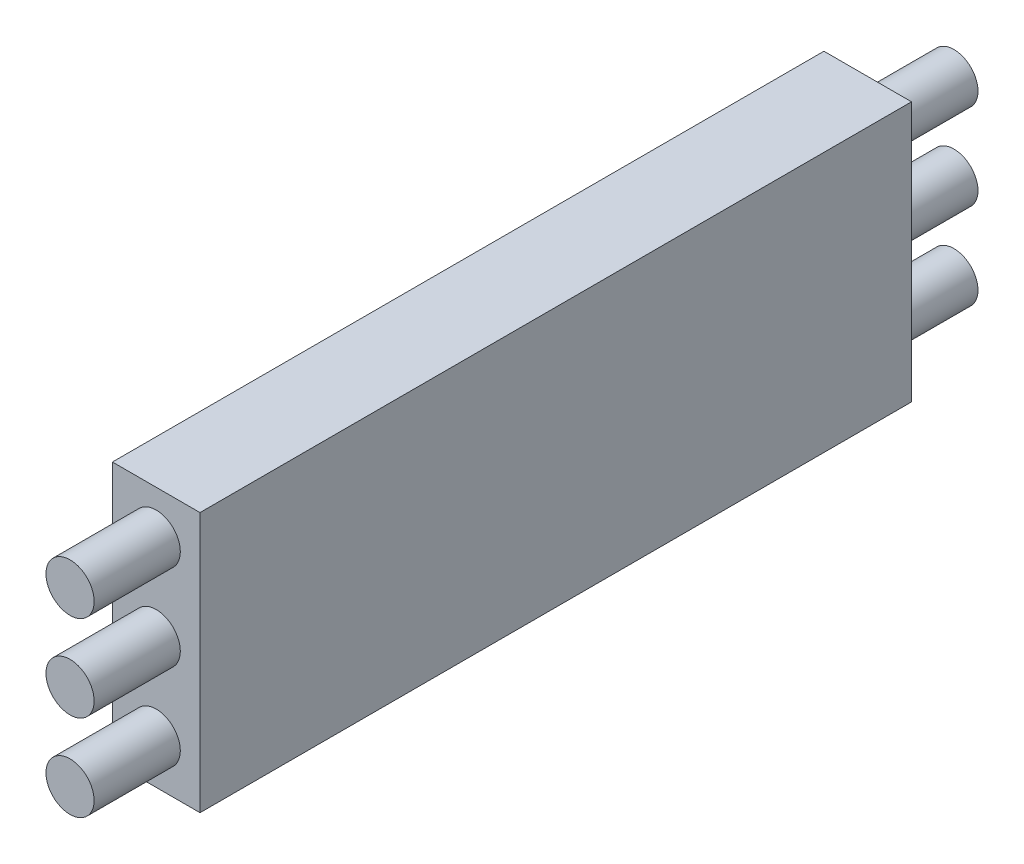
ISO-10303-21;
HEADER;
FILE_DESCRIPTION(('STEP AP214'),'2;1');
FILE_NAME('part.step','',(''),(''),'','','');
FILE_SCHEMA(('AUTOMOTIVE_DESIGN { 1 0 10303 214 1 1 1 1 }'));
ENDSEC;
DATA;
#1=APPLICATION_CONTEXT('core data for automotive mechanical design processes');
#2=APPLICATION_PROTOCOL_DEFINITION('international standard','automotive_design',2000,#1);
#3=PRODUCT_CONTEXT('',#1,'mechanical');
#4=PRODUCT('Part','Part','',(#3));
#5=PRODUCT_RELATED_PRODUCT_CATEGORY('part','',(#4));
#6=PRODUCT_DEFINITION_FORMATION('','',#4);
#7=PRODUCT_DEFINITION_CONTEXT('part definition',#1,'design');
#8=PRODUCT_DEFINITION('design','',#6,#7);
#9=PRODUCT_DEFINITION_SHAPE('','',#8);
#10=(LENGTH_UNIT() NAMED_UNIT(*) SI_UNIT(.MILLI.,.METRE.));
#11=(NAMED_UNIT(*) PLANE_ANGLE_UNIT() SI_UNIT($,.RADIAN.));
#12=(NAMED_UNIT(*) SI_UNIT($,.STERADIAN.) SOLID_ANGLE_UNIT());
#13=UNCERTAINTY_MEASURE_WITH_UNIT(LENGTH_MEASURE(1.E-05),#10,'distance_accuracy_value','');
#14=(GEOMETRIC_REPRESENTATION_CONTEXT(3) GLOBAL_UNCERTAINTY_ASSIGNED_CONTEXT((#13)) GLOBAL_UNIT_ASSIGNED_CONTEXT((#10,
#11,#12)) REPRESENTATION_CONTEXT('',''));
#15=CARTESIAN_POINT('',(0.,0.,0.));
#16=DIRECTION('',(0.,0.,1.));
#17=DIRECTION('',(1.,0.,0.));
#18=AXIS2_PLACEMENT_3D('',#15,#16,#17);
#19=CARTESIAN_POINT('',(110.,20.0000000000002,-10.));
#20=DIRECTION('',(0.,0.,1.));
#21=DIRECTION('',(1.,0.,0.));
#22=AXIS2_PLACEMENT_3D('',#19,#20,#21);
#23=CYLINDRICAL_SURFACE('',#22,2.79400000000001);
#24=CARTESIAN_POINT('',(110.,20.0000000000002,-10.));
#25=DIRECTION('',(0.,0.,1.));
#26=DIRECTION('',(1.,0.,0.));
#27=AXIS2_PLACEMENT_3D('',#24,#25,#26);
#28=CIRCLE('',#27,2.79400000000001);
#29=CARTESIAN_POINT('',(112.794,20.0000000000002,-10.));
#30=VERTEX_POINT('',#29);
#31=EDGE_CURVE('E11',#30,#30,#28,.T.);
#32=ORIENTED_EDGE('',*,*,#31,.T.);
#33=EDGE_LOOP('',(#32));
#34=FACE_BOUND('',#33,.T.);
#35=CARTESIAN_POINT('',(110.,20.0000000000002,0.));
#36=DIRECTION('',(0.,0.,1.));
#37=DIRECTION('',(1.,0.,0.));
#38=AXIS2_PLACEMENT_3D('',#35,#36,#37);
#39=CIRCLE('',#38,2.79400000000001);
#40=CARTESIAN_POINT('',(112.794,20.0000000000002,0.));
#41=VERTEX_POINT('',#40);
#42=EDGE_CURVE('E42',#41,#41,#39,.T.);
#43=ORIENTED_EDGE('',*,*,#42,.F.);
#44=EDGE_LOOP('',(#43));
#45=FACE_BOUND('',#44,.T.);
#46=ADVANCED_FACE('F39',(#34,#45),#23,.T.);
#47=CARTESIAN_POINT('',(110.,20.0000000000002,-10.));
#48=DIRECTION('',(0.,0.,1.));
#49=DIRECTION('',(1.,0.,0.));
#50=AXIS2_PLACEMENT_3D('',#47,#48,#49);
#51=PLANE('',#50);
#52=ORIENTED_EDGE('',*,*,#31,.F.);
#53=EDGE_LOOP('',(#52));
#54=FACE_BOUND('',#53,.T.);
#55=ADVANCED_FACE('F122',(#54),#51,.F.);
#56=CARTESIAN_POINT('',(104.92,4.92000000000019,82.55));
#57=DIRECTION('',(1.,0.,0.));
#58=DIRECTION('',(0.,0.,-1.));
#59=AXIS2_PLACEMENT_3D('',#56,#57,#58);
#60=PLANE('',#59);
#61=DIRECTION('',(0.,-1.,0.));
#62=VECTOR('',#61,1.);
#63=CARTESIAN_POINT('',(104.92,4.92000000000019,0.));
#64=LINE('',#63,#62);
#65=CARTESIAN_POINT('',(104.92,35.0800000000002,0.));
#66=VERTEX_POINT('',#65);
#67=CARTESIAN_POINT('',(104.92,4.92000000000019,0.));
#68=VERTEX_POINT('',#67);
#69=EDGE_CURVE('E106',#66,#68,#64,.T.);
#70=ORIENTED_EDGE('',*,*,#69,.T.);
#71=DIRECTION('',(0.,0.,-1.));
#72=VECTOR('',#71,1.);
#73=CARTESIAN_POINT('',(104.92,4.92000000000019,82.55));
#74=LINE('',#73,#72);
#75=CARTESIAN_POINT('',(104.92,4.92000000000019,82.55));
#76=VERTEX_POINT('',#75);
#77=EDGE_CURVE('E97',#76,#68,#74,.T.);
#78=ORIENTED_EDGE('',*,*,#77,.F.);
#79=DIRECTION('',(0.,-1.,0.));
#80=VECTOR('',#79,1.);
#81=CARTESIAN_POINT('',(104.92,4.92000000000019,82.55));
#82=LINE('',#81,#80);
#83=CARTESIAN_POINT('',(104.92,35.0800000000002,82.55));
#84=VERTEX_POINT('',#83);
#85=EDGE_CURVE('E91',#84,#76,#82,.T.);
#86=ORIENTED_EDGE('',*,*,#85,.F.);
#87=DIRECTION('',(0.,0.,-1.));
#88=VECTOR('',#87,1.);
#89=CARTESIAN_POINT('',(104.92,35.0800000000002,82.55));
#90=LINE('',#89,#88);
#91=EDGE_CURVE('E102',#84,#66,#90,.T.);
#92=ORIENTED_EDGE('',*,*,#91,.T.);
#93=EDGE_LOOP('',(#70,#78,#86,#92));
#94=FACE_BOUND('',#93,.T.);
#95=ADVANCED_FACE('F127',(#94),#60,.F.);
#96=CARTESIAN_POINT('',(115.08,4.92000000000019,82.55));
#97=DIRECTION('',(0.,1.,0.));
#98=DIRECTION('',(0.,0.,1.));
#99=AXIS2_PLACEMENT_3D('',#96,#97,#98);
#100=PLANE('',#99);
#101=DIRECTION('',(1.,0.,0.));
#102=VECTOR('',#101,1.);
#103=CARTESIAN_POINT('',(115.08,4.92000000000019,0.));
#104=LINE('',#103,#102);
#105=CARTESIAN_POINT('',(115.08,4.92000000000019,0.));
#106=VERTEX_POINT('',#105);
#107=EDGE_CURVE('E96',#68,#106,#104,.T.);
#108=ORIENTED_EDGE('',*,*,#107,.T.);
#109=DIRECTION('',(0.,0.,-1.));
#110=VECTOR('',#109,1.);
#111=CARTESIAN_POINT('',(115.08,4.92000000000019,82.55));
#112=LINE('',#111,#110);
#113=CARTESIAN_POINT('',(115.08,4.92000000000019,82.55));
#114=VERTEX_POINT('',#113);
#115=EDGE_CURVE('E94',#114,#106,#112,.T.);
#116=ORIENTED_EDGE('',*,*,#115,.F.);
#117=DIRECTION('',(1.,0.,0.));
#118=VECTOR('',#117,1.);
#119=CARTESIAN_POINT('',(115.08,4.92000000000019,82.55));
#120=LINE('',#119,#118);
#121=EDGE_CURVE('E86',#76,#114,#120,.T.);
#122=ORIENTED_EDGE('',*,*,#121,.F.);
#123=ORIENTED_EDGE('',*,*,#77,.T.);
#124=EDGE_LOOP('',(#108,#116,#122,#123));
#125=FACE_BOUND('',#124,.T.);
#126=ADVANCED_FACE('F95',(#125),#100,.F.);
#127=CARTESIAN_POINT('',(115.08,4.92000000000019,82.55));
#128=DIRECTION('',(-1.,0.,0.));
#129=DIRECTION('',(0.,0.,1.));
#130=AXIS2_PLACEMENT_3D('',#127,#128,#129);
#131=PLANE('',#130);
#132=DIRECTION('',(0.,1.,0.));
#133=VECTOR('',#132,1.);
#134=CARTESIAN_POINT('',(115.08,4.92000000000019,0.));
#135=LINE('',#134,#133);
#136=CARTESIAN_POINT('',(115.08,35.0800000000002,0.));
#137=VERTEX_POINT('',#136);
#138=EDGE_CURVE('E72',#106,#137,#135,.T.);
#139=ORIENTED_EDGE('',*,*,#138,.T.);
#140=DIRECTION('',(0.,0.,-1.));
#141=VECTOR('',#140,1.);
#142=CARTESIAN_POINT('',(115.08,35.0800000000002,82.55));
#143=LINE('',#142,#141);
#144=CARTESIAN_POINT('',(115.08,35.0800000000002,82.55));
#145=VERTEX_POINT('',#144);
#146=EDGE_CURVE('E98',#145,#137,#143,.T.);
#147=ORIENTED_EDGE('',*,*,#146,.F.);
#148=DIRECTION('',(0.,1.,0.));
#149=VECTOR('',#148,1.);
#150=CARTESIAN_POINT('',(115.08,4.92000000000019,82.55));
#151=LINE('',#150,#149);
#152=EDGE_CURVE('E89',#114,#145,#151,.T.);
#153=ORIENTED_EDGE('',*,*,#152,.F.);
#154=ORIENTED_EDGE('',*,*,#115,.T.);
#155=EDGE_LOOP('',(#139,#147,#153,#154));
#156=FACE_BOUND('',#155,.T.);
#157=ADVANCED_FACE('F100',(#156),#131,.F.);
#158=CARTESIAN_POINT('',(115.08,35.0800000000002,82.55));
#159=DIRECTION('',(0.,-1.,0.));
#160=DIRECTION('',(0.,0.,-1.));
#161=AXIS2_PLACEMENT_3D('',#158,#159,#160);
#162=PLANE('',#161);
#163=DIRECTION('',(-1.,0.,0.));
#164=VECTOR('',#163,1.);
#165=CARTESIAN_POINT('',(115.08,35.0800000000002,0.));
#166=LINE('',#165,#164);
#167=EDGE_CURVE('E78',#137,#66,#166,.T.);
#168=ORIENTED_EDGE('',*,*,#167,.T.);
#169=ORIENTED_EDGE('',*,*,#91,.F.);
#170=DIRECTION('',(-1.,0.,0.));
#171=VECTOR('',#170,1.);
#172=CARTESIAN_POINT('',(115.08,35.0800000000002,82.55));
#173=LINE('',#172,#171);
#174=EDGE_CURVE('E55',#145,#84,#173,.T.);
#175=ORIENTED_EDGE('',*,*,#174,.F.);
#176=ORIENTED_EDGE('',*,*,#146,.T.);
#177=EDGE_LOOP('',(#168,#169,#175,#176));
#178=FACE_BOUND('',#177,.T.);
#179=ADVANCED_FACE('F140',(#178),#162,.F.);
#180=CARTESIAN_POINT('',(0.,0.,82.55));
#181=DIRECTION('',(0.,0.,1.));
#182=DIRECTION('',(1.,0.,0.));
#183=AXIS2_PLACEMENT_3D('',#180,#181,#182);
#184=PLANE('',#183);
#185=CARTESIAN_POINT('',(110.,30.0000000000002,82.55));
#186=DIRECTION('',(0.,0.,1.));
#187=DIRECTION('',(1.,0.,0.));
#188=AXIS2_PLACEMENT_3D('',#185,#186,#187);
#189=CIRCLE('',#188,2.79400000000001);
#190=CARTESIAN_POINT('',(112.794,30.0000000000002,82.55));
#191=VERTEX_POINT('',#190);
#192=EDGE_CURVE('E196',#191,#191,#189,.T.);
#193=ORIENTED_EDGE('',*,*,#192,.F.);
#194=EDGE_LOOP('',(#193));
#195=FACE_BOUND('',#194,.T.);
#196=CARTESIAN_POINT('',(110.,20.0000000000002,82.55));
#197=DIRECTION('',(0.,0.,1.));
#198=DIRECTION('',(1.,0.,0.));
#199=AXIS2_PLACEMENT_3D('',#196,#197,#198);
#200=CIRCLE('',#199,2.79400000000001);
#201=CARTESIAN_POINT('',(112.794,20.0000000000002,82.55));
#202=VERTEX_POINT('',#201);
#203=EDGE_CURVE('E200',#202,#202,#200,.T.);
#204=ORIENTED_EDGE('',*,*,#203,.F.);
#205=EDGE_LOOP('',(#204));
#206=FACE_BOUND('',#205,.T.);
#207=CARTESIAN_POINT('',(110.,10.0000000000002,82.55));
#208=DIRECTION('',(0.,0.,1.));
#209=DIRECTION('',(1.,0.,0.));
#210=AXIS2_PLACEMENT_3D('',#207,#208,#209);
#211=CIRCLE('',#210,2.79400000000001);
#212=CARTESIAN_POINT('',(112.794,10.0000000000002,82.55));
#213=VERTEX_POINT('',#212);
#214=EDGE_CURVE('E205',#213,#213,#211,.T.);
#215=ORIENTED_EDGE('',*,*,#214,.F.);
#216=EDGE_LOOP('',(#215));
#217=FACE_BOUND('',#216,.T.);
#218=ORIENTED_EDGE('',*,*,#85,.T.);
#219=ORIENTED_EDGE('',*,*,#121,.T.);
#220=ORIENTED_EDGE('',*,*,#152,.T.);
#221=ORIENTED_EDGE('',*,*,#174,.T.);
#222=EDGE_LOOP('',(#218,#219,#220,#221));
#223=FACE_BOUND('',#222,.T.);
#224=ADVANCED_FACE('F87',(#195,#206,#217,#223),#184,.T.);
#225=CARTESIAN_POINT('',(0.,0.,0.));
#226=DIRECTION('',(0.,0.,1.));
#227=DIRECTION('',(1.,0.,0.));
#228=AXIS2_PLACEMENT_3D('',#225,#226,#227);
#229=PLANE('',#228);
#230=CARTESIAN_POINT('',(110.,30.0000000000002,0.));
#231=DIRECTION('',(0.,0.,1.));
#232=DIRECTION('',(1.,0.,0.));
#233=AXIS2_PLACEMENT_3D('',#230,#231,#232);
#234=CIRCLE('',#233,2.79400000000001);
#235=CARTESIAN_POINT('',(112.794,30.0000000000002,0.));
#236=VERTEX_POINT('',#235);
#237=EDGE_CURVE('E213',#236,#236,#234,.T.);
#238=ORIENTED_EDGE('',*,*,#237,.T.);
#239=EDGE_LOOP('',(#238));
#240=FACE_BOUND('',#239,.T.);
#241=CARTESIAN_POINT('',(110.,10.0000000000002,0.));
#242=DIRECTION('',(0.,0.,1.));
#243=DIRECTION('',(1.,0.,0.));
#244=AXIS2_PLACEMENT_3D('',#241,#242,#243);
#245=CIRCLE('',#244,2.79400000000001);
#246=CARTESIAN_POINT('',(112.794,10.0000000000002,0.));
#247=VERTEX_POINT('',#246);
#248=EDGE_CURVE('E109',#247,#247,#245,.T.);
#249=ORIENTED_EDGE('',*,*,#248,.T.);
#250=EDGE_LOOP('',(#249));
#251=FACE_BOUND('',#250,.T.);
#252=ORIENTED_EDGE('',*,*,#42,.T.);
#253=EDGE_LOOP('',(#252));
#254=FACE_BOUND('',#253,.T.);
#255=ORIENTED_EDGE('',*,*,#69,.F.);
#256=ORIENTED_EDGE('',*,*,#167,.F.);
#257=ORIENTED_EDGE('',*,*,#138,.F.);
#258=ORIENTED_EDGE('',*,*,#107,.F.);
#259=EDGE_LOOP('',(#255,#256,#257,#258));
#260=FACE_BOUND('',#259,.T.);
#261=ADVANCED_FACE('F118',(#240,#251,#254,#260),#229,.F.);
#262=CARTESIAN_POINT('',(110.,10.0000000000002,-10.));
#263=DIRECTION('',(0.,0.,1.));
#264=DIRECTION('',(1.,0.,0.));
#265=AXIS2_PLACEMENT_3D('',#262,#263,#264);
#266=CYLINDRICAL_SURFACE('',#265,2.79400000000001);
#267=CARTESIAN_POINT('',(110.,10.0000000000002,-10.));
#268=DIRECTION('',(0.,0.,1.));
#269=DIRECTION('',(1.,0.,0.));
#270=AXIS2_PLACEMENT_3D('',#267,#268,#269);
#271=CIRCLE('',#270,2.79400000000001);
#272=CARTESIAN_POINT('',(112.794,10.0000000000002,-10.));
#273=VERTEX_POINT('',#272);
#274=EDGE_CURVE('E216',#273,#273,#271,.T.);
#275=ORIENTED_EDGE('',*,*,#274,.T.);
#276=EDGE_LOOP('',(#275));
#277=FACE_BOUND('',#276,.T.);
#278=ORIENTED_EDGE('',*,*,#248,.F.);
#279=EDGE_LOOP('',(#278));
#280=FACE_BOUND('',#279,.T.);
#281=ADVANCED_FACE('F145',(#277,#280),#266,.T.);
#282=CARTESIAN_POINT('',(110.,10.0000000000002,-10.));
#283=DIRECTION('',(0.,0.,1.));
#284=DIRECTION('',(1.,0.,0.));
#285=AXIS2_PLACEMENT_3D('',#282,#283,#284);
#286=PLANE('',#285);
#287=ORIENTED_EDGE('',*,*,#274,.F.);
#288=EDGE_LOOP('',(#287));
#289=FACE_BOUND('',#288,.T.);
#290=ADVANCED_FACE('F150',(#289),#286,.F.);
#291=CARTESIAN_POINT('',(110.,30.0000000000002,-10.));
#292=DIRECTION('',(0.,0.,1.));
#293=DIRECTION('',(1.,0.,0.));
#294=AXIS2_PLACEMENT_3D('',#291,#292,#293);
#295=CYLINDRICAL_SURFACE('',#294,2.79400000000001);
#296=CARTESIAN_POINT('',(110.,30.0000000000002,-10.));
#297=DIRECTION('',(0.,0.,1.));
#298=DIRECTION('',(1.,0.,0.));
#299=AXIS2_PLACEMENT_3D('',#296,#297,#298);
#300=CIRCLE('',#299,2.79400000000001);
#301=CARTESIAN_POINT('',(112.794,30.0000000000002,-10.));
#302=VERTEX_POINT('',#301);
#303=EDGE_CURVE('E210',#302,#302,#300,.T.);
#304=ORIENTED_EDGE('',*,*,#303,.T.);
#305=EDGE_LOOP('',(#304));
#306=FACE_BOUND('',#305,.T.);
#307=ORIENTED_EDGE('',*,*,#237,.F.);
#308=EDGE_LOOP('',(#307));
#309=FACE_BOUND('',#308,.T.);
#310=ADVANCED_FACE('F153',(#306,#309),#295,.T.);
#311=CARTESIAN_POINT('',(110.,30.0000000000002,-10.));
#312=DIRECTION('',(0.,0.,1.));
#313=DIRECTION('',(1.,0.,0.));
#314=AXIS2_PLACEMENT_3D('',#311,#312,#313);
#315=PLANE('',#314);
#316=ORIENTED_EDGE('',*,*,#303,.F.);
#317=EDGE_LOOP('',(#316));
#318=FACE_BOUND('',#317,.T.);
#319=ADVANCED_FACE('F158',(#318),#315,.F.);
#320=CARTESIAN_POINT('',(110.,10.0000000000002,92.55));
#321=DIRECTION('',(0.,0.,-1.));
#322=DIRECTION('',(-1.,0.,0.));
#323=AXIS2_PLACEMENT_3D('',#320,#321,#322);
#324=CYLINDRICAL_SURFACE('',#323,2.79400000000001);
#325=CARTESIAN_POINT('',(110.,10.0000000000002,92.55));
#326=DIRECTION('',(0.,0.,1.));
#327=DIRECTION('',(1.,0.,0.));
#328=AXIS2_PLACEMENT_3D('',#325,#326,#327);
#329=CIRCLE('',#328,2.79400000000001);
#330=CARTESIAN_POINT('',(112.794,10.0000000000002,92.55));
#331=VERTEX_POINT('',#330);
#332=EDGE_CURVE('E207',#331,#331,#329,.T.);
#333=ORIENTED_EDGE('',*,*,#332,.F.);
#334=EDGE_LOOP('',(#333));
#335=FACE_BOUND('',#334,.T.);
#336=ORIENTED_EDGE('',*,*,#214,.T.);
#337=EDGE_LOOP('',(#336));
#338=FACE_BOUND('',#337,.T.);
#339=ADVANCED_FACE('F161',(#335,#338),#324,.T.);
#340=CARTESIAN_POINT('',(110.,10.0000000000002,92.55));
#341=DIRECTION('',(0.,0.,1.));
#342=DIRECTION('',(1.,0.,0.));
#343=AXIS2_PLACEMENT_3D('',#340,#341,#342);
#344=PLANE('',#343);
#345=ORIENTED_EDGE('',*,*,#332,.T.);
#346=EDGE_LOOP('',(#345));
#347=FACE_BOUND('',#346,.T.);
#348=ADVANCED_FACE('F168',(#347),#344,.T.);
#349=CARTESIAN_POINT('',(110.,20.0000000000002,92.55));
#350=DIRECTION('',(0.,0.,-1.));
#351=DIRECTION('',(-1.,0.,0.));
#352=AXIS2_PLACEMENT_3D('',#349,#350,#351);
#353=CYLINDRICAL_SURFACE('',#352,2.79400000000001);
#354=CARTESIAN_POINT('',(110.,20.0000000000002,92.55));
#355=DIRECTION('',(0.,0.,1.));
#356=DIRECTION('',(1.,0.,0.));
#357=AXIS2_PLACEMENT_3D('',#354,#355,#356);
#358=CIRCLE('',#357,2.79400000000001);
#359=CARTESIAN_POINT('',(112.794,20.0000000000002,92.55));
#360=VERTEX_POINT('',#359);
#361=EDGE_CURVE('E197',#360,#360,#358,.T.);
#362=ORIENTED_EDGE('',*,*,#361,.F.);
#363=EDGE_LOOP('',(#362));
#364=FACE_BOUND('',#363,.T.);
#365=ORIENTED_EDGE('',*,*,#203,.T.);
#366=EDGE_LOOP('',(#365));
#367=FACE_BOUND('',#366,.T.);
#368=ADVANCED_FACE('F172',(#364,#367),#353,.T.);
#369=CARTESIAN_POINT('',(110.,20.0000000000002,92.55));
#370=DIRECTION('',(0.,0.,1.));
#371=DIRECTION('',(1.,0.,0.));
#372=AXIS2_PLACEMENT_3D('',#369,#370,#371);
#373=PLANE('',#372);
#374=ORIENTED_EDGE('',*,*,#361,.T.);
#375=EDGE_LOOP('',(#374));
#376=FACE_BOUND('',#375,.T.);
#377=ADVANCED_FACE('F174',(#376),#373,.T.);
#378=CARTESIAN_POINT('',(110.,30.0000000000002,92.55));
#379=DIRECTION('',(0.,0.,-1.));
#380=DIRECTION('',(-1.,0.,0.));
#381=AXIS2_PLACEMENT_3D('',#378,#379,#380);
#382=CYLINDRICAL_SURFACE('',#381,2.79400000000001);
#383=CARTESIAN_POINT('',(110.,30.0000000000002,92.55));
#384=DIRECTION('',(0.,0.,1.));
#385=DIRECTION('',(1.,0.,0.));
#386=AXIS2_PLACEMENT_3D('',#383,#384,#385);
#387=CIRCLE('',#386,2.79400000000001);
#388=CARTESIAN_POINT('',(112.794,30.0000000000002,92.55));
#389=VERTEX_POINT('',#388);
#390=EDGE_CURVE('E193',#389,#389,#387,.T.);
#391=ORIENTED_EDGE('',*,*,#390,.F.);
#392=EDGE_LOOP('',(#391));
#393=FACE_BOUND('',#392,.T.);
#394=ORIENTED_EDGE('',*,*,#192,.T.);
#395=EDGE_LOOP('',(#394));
#396=FACE_BOUND('',#395,.T.);
#397=ADVANCED_FACE('F177',(#393,#396),#382,.T.);
#398=CARTESIAN_POINT('',(110.,30.0000000000002,92.55));
#399=DIRECTION('',(0.,0.,1.));
#400=DIRECTION('',(1.,0.,0.));
#401=AXIS2_PLACEMENT_3D('',#398,#399,#400);
#402=PLANE('',#401);
#403=ORIENTED_EDGE('',*,*,#390,.T.);
#404=EDGE_LOOP('',(#403));
#405=FACE_BOUND('',#404,.T.);
#406=ADVANCED_FACE('F182',(#405),#402,.T.);
#407=CLOSED_SHELL('',(#46,#55,#95,#126,#157,#179,#224,#261,#281,#290,#310,#319,#339,#348,#368,
#377,#397,#406));
#408=MANIFOLD_SOLID_BREP('B2',#407);
#409=ADVANCED_BREP_SHAPE_REPRESENTATION('',(#18,#408),#14);
#410=SHAPE_DEFINITION_REPRESENTATION(#9,#409);
ENDSEC;
END-ISO-10303-21;
